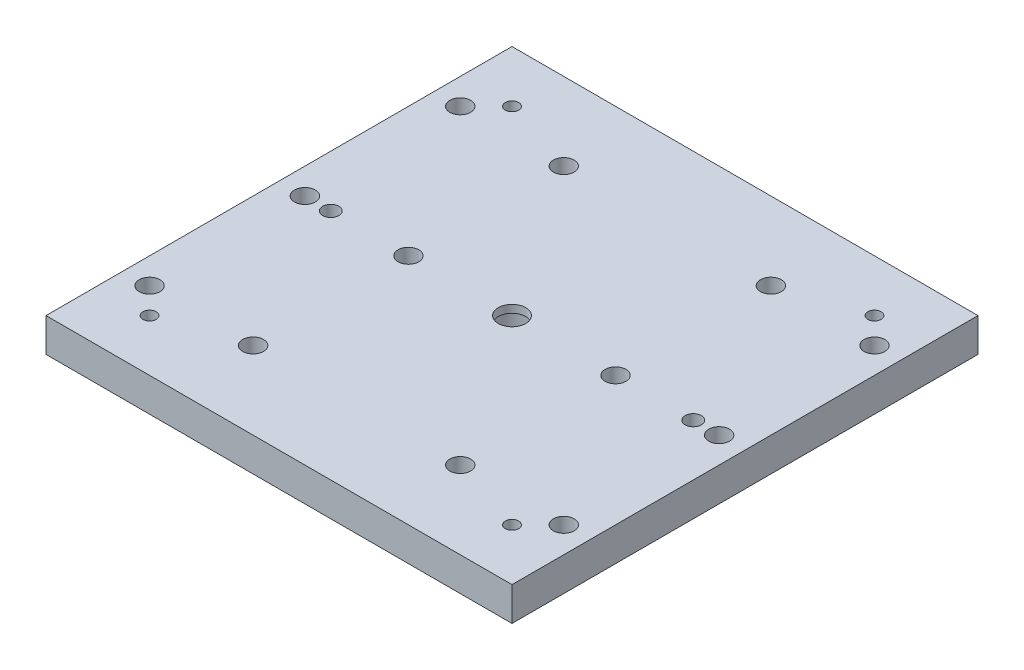
ISO-10303-21;
HEADER;
FILE_DESCRIPTION(('STEP AP214'),'2;1');
FILE_NAME('part.step','',(''),(''),'','','');
FILE_SCHEMA(('AUTOMOTIVE_DESIGN { 1 0 10303 214 1 1 1 1 }'));
ENDSEC;
DATA;
#1=APPLICATION_CONTEXT('core data for automotive mechanical design processes');
#2=APPLICATION_PROTOCOL_DEFINITION('international standard','automotive_design',2000,#1);
#3=PRODUCT_CONTEXT('',#1,'mechanical');
#4=PRODUCT('Part','Part','',(#3));
#5=PRODUCT_RELATED_PRODUCT_CATEGORY('part','',(#4));
#6=PRODUCT_DEFINITION_FORMATION('','',#4);
#7=PRODUCT_DEFINITION_CONTEXT('part definition',#1,'design');
#8=PRODUCT_DEFINITION('design','',#6,#7);
#9=PRODUCT_DEFINITION_SHAPE('','',#8);
#10=(LENGTH_UNIT() NAMED_UNIT(*) SI_UNIT(.MILLI.,.METRE.));
#11=(NAMED_UNIT(*) PLANE_ANGLE_UNIT() SI_UNIT($,.RADIAN.));
#12=(NAMED_UNIT(*) SI_UNIT($,.STERADIAN.) SOLID_ANGLE_UNIT());
#13=UNCERTAINTY_MEASURE_WITH_UNIT(LENGTH_MEASURE(1.E-05),#10,'distance_accuracy_value','');
#14=(GEOMETRIC_REPRESENTATION_CONTEXT(3) GLOBAL_UNCERTAINTY_ASSIGNED_CONTEXT((#13)) GLOBAL_UNIT_ASSIGNED_CONTEXT((#10,
#11,#12)) REPRESENTATION_CONTEXT('',''));
#15=CARTESIAN_POINT('',(0.,0.,0.));
#16=DIRECTION('',(0.,0.,1.));
#17=DIRECTION('',(1.,0.,0.));
#18=AXIS2_PLACEMENT_3D('',#15,#16,#17);
#19=CARTESIAN_POINT('',(0.,0.,0.));
#20=DIRECTION('',(0.,1.,0.));
#21=DIRECTION('',(0.,0.,1.));
#22=AXIS2_PLACEMENT_3D('',#19,#20,#21);
#23=PLANE('',#22);
#24=CARTESIAN_POINT('',(25.4,0.,-38.1));
#25=DIRECTION('',(0.,-1.,0.));
#26=DIRECTION('',(0.,0.,-1.));
#27=AXIS2_PLACEMENT_3D('',#24,#25,#26);
#28=CIRCLE('',#27,2.5527);
#29=CARTESIAN_POINT('',(25.4,0.,-40.6527));
#30=VERTEX_POINT('',#29);
#31=EDGE_CURVE('E220',#30,#30,#28,.T.);
#32=ORIENTED_EDGE('',*,*,#31,.F.);
#33=EDGE_LOOP('',(#32));
#34=FACE_BOUND('',#33,.T.);
#35=CARTESIAN_POINT('',(50.8,0.,-38.1));
#36=DIRECTION('',(0.,-1.,0.));
#37=DIRECTION('',(0.,0.,-1.));
#38=AXIS2_PLACEMENT_3D('',#35,#36,#37);
#39=CIRCLE('',#38,2.5527);
#40=CARTESIAN_POINT('',(50.8,0.,-40.6527));
#41=VERTEX_POINT('',#40);
#42=EDGE_CURVE('E214',#41,#41,#39,.T.);
#43=ORIENTED_EDGE('',*,*,#42,.F.);
#44=EDGE_LOOP('',(#43));
#45=FACE_BOUND('',#44,.T.);
#46=CARTESIAN_POINT('',(50.8,0.,0.));
#47=DIRECTION('',(0.,-1.,0.));
#48=DIRECTION('',(0.,0.,-1.));
#49=AXIS2_PLACEMENT_3D('',#46,#47,#48);
#50=CIRCLE('',#49,2.5527);
#51=CARTESIAN_POINT('',(50.8,0.,-2.55269999999999));
#52=VERTEX_POINT('',#51);
#53=EDGE_CURVE('E208',#52,#52,#50,.T.);
#54=ORIENTED_EDGE('',*,*,#53,.F.);
#55=EDGE_LOOP('',(#54));
#56=FACE_BOUND('',#55,.T.);
#57=CARTESIAN_POINT('',(25.4,0.,0.));
#58=DIRECTION('',(0.,-1.,0.));
#59=DIRECTION('',(0.,0.,-1.));
#60=AXIS2_PLACEMENT_3D('',#57,#58,#59);
#61=CIRCLE('',#60,2.5527);
#62=CARTESIAN_POINT('',(25.4,0.,-2.55269999999999));
#63=VERTEX_POINT('',#62);
#64=EDGE_CURVE('E202',#63,#63,#61,.T.);
#65=ORIENTED_EDGE('',*,*,#64,.F.);
#66=EDGE_LOOP('',(#65));
#67=FACE_BOUND('',#66,.T.);
#68=CARTESIAN_POINT('',(50.8,0.,38.1));
#69=DIRECTION('',(0.,-1.,0.));
#70=DIRECTION('',(0.,0.,-1.));
#71=AXIS2_PLACEMENT_3D('',#68,#69,#70);
#72=CIRCLE('',#71,2.5527);
#73=CARTESIAN_POINT('',(50.8,0.,35.5473));
#74=VERTEX_POINT('',#73);
#75=EDGE_CURVE('E190',#74,#74,#72,.T.);
#76=ORIENTED_EDGE('',*,*,#75,.F.);
#77=EDGE_LOOP('',(#76));
#78=FACE_BOUND('',#77,.T.);
#79=CARTESIAN_POINT('',(-44.45,0.,44.45));
#80=DIRECTION('',(0.,-1.,0.));
#81=DIRECTION('',(0.,0.,-1.));
#82=AXIS2_PLACEMENT_3D('',#79,#80,#81);
#83=CIRCLE('',#82,2.77876);
#84=CARTESIAN_POINT('',(-44.45,0.,41.67124));
#85=VERTEX_POINT('',#84);
#86=EDGE_CURVE('E184',#85,#85,#83,.T.);
#87=ORIENTED_EDGE('',*,*,#86,.F.);
#88=EDGE_LOOP('',(#87));
#89=FACE_BOUND('',#88,.T.);
#90=CARTESIAN_POINT('',(-44.45,0.,-44.45));
#91=DIRECTION('',(0.,-1.,0.));
#92=DIRECTION('',(0.,0.,-1.));
#93=AXIS2_PLACEMENT_3D('',#90,#91,#92);
#94=CIRCLE('',#93,2.77876);
#95=CARTESIAN_POINT('',(-44.45,0.,-47.22876));
#96=VERTEX_POINT('',#95);
#97=EDGE_CURVE('E172',#96,#96,#94,.T.);
#98=ORIENTED_EDGE('',*,*,#97,.F.);
#99=EDGE_LOOP('',(#98));
#100=FACE_BOUND('',#99,.T.);
#101=CARTESIAN_POINT('',(44.45,0.,-44.45));
#102=DIRECTION('',(0.,-1.,0.));
#103=DIRECTION('',(0.,0.,-1.));
#104=AXIS2_PLACEMENT_3D('',#101,#102,#103);
#105=CIRCLE('',#104,2.77876);
#106=CARTESIAN_POINT('',(44.45,0.,-47.22876));
#107=VERTEX_POINT('',#106);
#108=EDGE_CURVE('E160',#107,#107,#105,.T.);
#109=ORIENTED_EDGE('',*,*,#108,.F.);
#110=EDGE_LOOP('',(#109));
#111=FACE_BOUND('',#110,.T.);
#112=CARTESIAN_POINT('',(44.45,0.,0.));
#113=DIRECTION('',(0.,1.,0.));
#114=DIRECTION('',(0.,0.,1.));
#115=AXIS2_PLACEMENT_3D('',#112,#113,#114);
#116=CIRCLE('',#115,1.984375);
#117=CARTESIAN_POINT('',(44.45,0.,1.98437499999998));
#118=VERTEX_POINT('',#117);
#119=EDGE_CURVE('E133',#118,#118,#116,.T.);
#120=ORIENTED_EDGE('',*,*,#119,.T.);
#121=EDGE_LOOP('',(#120));
#122=FACE_BOUND('',#121,.T.);
#123=CARTESIAN_POINT('',(-44.45,0.,0.));
#124=DIRECTION('',(0.,1.,0.));
#125=DIRECTION('',(0.,0.,1.));
#126=AXIS2_PLACEMENT_3D('',#123,#124,#125);
#127=CIRCLE('',#126,1.984375);
#128=CARTESIAN_POINT('',(-44.45,0.,1.98437500000001));
#129=VERTEX_POINT('',#128);
#130=EDGE_CURVE('E127',#129,#129,#127,.T.);
#131=ORIENTED_EDGE('',*,*,#130,.T.);
#132=EDGE_LOOP('',(#131));
#133=FACE_BOUND('',#132,.T.);
#134=CARTESIAN_POINT('',(0.,0.,0.));
#135=DIRECTION('',(0.,-1.,0.));
#136=DIRECTION('',(0.,0.,-1.));
#137=AXIS2_PLACEMENT_3D('',#134,#135,#136);
#138=CIRCLE('',#137,5.55625);
#139=CARTESIAN_POINT('',(0.,0.,-5.55625));
#140=VERTEX_POINT('',#139);
#141=EDGE_CURVE('E124',#140,#140,#138,.T.);
#142=ORIENTED_EDGE('',*,*,#141,.F.);
#143=EDGE_LOOP('',(#142));
#144=FACE_BOUND('',#143,.T.);
#145=DIRECTION('',(0.,0.,-1.));
#146=VECTOR('',#145,1.);
#147=CARTESIAN_POINT('',(57.15,0.,-57.15));
#148=LINE('',#147,#146);
#149=CARTESIAN_POINT('',(57.15,0.,57.15));
#150=VERTEX_POINT('',#149);
#151=CARTESIAN_POINT('',(57.15,0.,-57.15));
#152=VERTEX_POINT('',#151);
#153=EDGE_CURVE('E102',#150,#152,#148,.T.);
#154=ORIENTED_EDGE('',*,*,#153,.F.);
#155=DIRECTION('',(1.,0.,0.));
#156=VECTOR('',#155,1.);
#157=CARTESIAN_POINT('',(-57.15,0.,57.15));
#158=LINE('',#157,#156);
#159=CARTESIAN_POINT('',(-57.15,0.,57.15));
#160=VERTEX_POINT('',#159);
#161=EDGE_CURVE('E78',#160,#150,#158,.T.);
#162=ORIENTED_EDGE('',*,*,#161,.F.);
#163=DIRECTION('',(0.,0.,1.));
#164=VECTOR('',#163,1.);
#165=CARTESIAN_POINT('',(-57.15,0.,-57.15));
#166=LINE('',#165,#164);
#167=CARTESIAN_POINT('',(-57.15,0.,-57.15));
#168=VERTEX_POINT('',#167);
#169=EDGE_CURVE('E72',#168,#160,#166,.T.);
#170=ORIENTED_EDGE('',*,*,#169,.F.);
#171=DIRECTION('',(-1.,0.,0.));
#172=VECTOR('',#171,1.);
#173=CARTESIAN_POINT('',(-57.15,0.,-57.15));
#174=LINE('',#173,#172);
#175=EDGE_CURVE('E94',#152,#168,#174,.T.);
#176=ORIENTED_EDGE('',*,*,#175,.F.);
#177=EDGE_LOOP('',(#154,#162,#170,#176));
#178=FACE_BOUND('',#177,.T.);
#179=CARTESIAN_POINT('',(44.45,0.,44.45));
#180=DIRECTION('',(0.,-1.,0.));
#181=DIRECTION('',(0.,0.,-1.));
#182=AXIS2_PLACEMENT_3D('',#179,#180,#181);
#183=CIRCLE('',#182,2.77876);
#184=CARTESIAN_POINT('',(44.45,0.,41.67124));
#185=VERTEX_POINT('',#184);
#186=EDGE_CURVE('E148',#185,#185,#183,.T.);
#187=ORIENTED_EDGE('',*,*,#186,.F.);
#188=EDGE_LOOP('',(#187));
#189=FACE_BOUND('',#188,.T.);
#190=CARTESIAN_POINT('',(25.4,0.,38.1));
#191=DIRECTION('',(0.,-1.,0.));
#192=DIRECTION('',(0.,0.,-1.));
#193=AXIS2_PLACEMENT_3D('',#190,#191,#192);
#194=CIRCLE('',#193,2.5527);
#195=CARTESIAN_POINT('',(25.4,0.,35.5473));
#196=VERTEX_POINT('',#195);
#197=EDGE_CURVE('E196',#196,#196,#194,.T.);
#198=ORIENTED_EDGE('',*,*,#197,.F.);
#199=EDGE_LOOP('',(#198));
#200=FACE_BOUND('',#199,.T.);
#201=CARTESIAN_POINT('',(-25.4,0.,-38.1));
#202=DIRECTION('',(0.,-1.,0.));
#203=DIRECTION('',(0.,0.,-1.));
#204=AXIS2_PLACEMENT_3D('',#201,#202,#203);
#205=CIRCLE('',#204,2.5527);
#206=CARTESIAN_POINT('',(-25.4,0.,-40.6527));
#207=VERTEX_POINT('',#206);
#208=EDGE_CURVE('E226',#207,#207,#205,.T.);
#209=ORIENTED_EDGE('',*,*,#208,.F.);
#210=EDGE_LOOP('',(#209));
#211=FACE_BOUND('',#210,.T.);
#212=CARTESIAN_POINT('',(-50.8,0.,-38.1));
#213=DIRECTION('',(0.,-1.,0.));
#214=DIRECTION('',(0.,0.,-1.));
#215=AXIS2_PLACEMENT_3D('',#212,#213,#214);
#216=CIRCLE('',#215,2.5527);
#217=CARTESIAN_POINT('',(-50.8,0.,-40.6527));
#218=VERTEX_POINT('',#217);
#219=EDGE_CURVE('E232',#218,#218,#216,.T.);
#220=ORIENTED_EDGE('',*,*,#219,.F.);
#221=EDGE_LOOP('',(#220));
#222=FACE_BOUND('',#221,.T.);
#223=CARTESIAN_POINT('',(-50.8,0.,0.));
#224=DIRECTION('',(0.,-1.,0.));
#225=DIRECTION('',(0.,0.,-1.));
#226=AXIS2_PLACEMENT_3D('',#223,#224,#225);
#227=CIRCLE('',#226,2.5527);
#228=CARTESIAN_POINT('',(-50.8,0.,-2.55269999999999));
#229=VERTEX_POINT('',#228);
#230=EDGE_CURVE('E238',#229,#229,#227,.T.);
#231=ORIENTED_EDGE('',*,*,#230,.F.);
#232=EDGE_LOOP('',(#231));
#233=FACE_BOUND('',#232,.T.);
#234=CARTESIAN_POINT('',(-25.4,0.,0.));
#235=DIRECTION('',(0.,-1.,0.));
#236=DIRECTION('',(0.,0.,-1.));
#237=AXIS2_PLACEMENT_3D('',#234,#235,#236);
#238=CIRCLE('',#237,2.5527);
#239=CARTESIAN_POINT('',(-25.4,0.,-2.55269999999999));
#240=VERTEX_POINT('',#239);
#241=EDGE_CURVE('E244',#240,#240,#238,.T.);
#242=ORIENTED_EDGE('',*,*,#241,.F.);
#243=EDGE_LOOP('',(#242));
#244=FACE_BOUND('',#243,.T.);
#245=CARTESIAN_POINT('',(-25.4,0.,38.1));
#246=DIRECTION('',(0.,-1.,0.));
#247=DIRECTION('',(0.,0.,-1.));
#248=AXIS2_PLACEMENT_3D('',#245,#246,#247);
#249=CIRCLE('',#248,2.5527);
#250=CARTESIAN_POINT('',(-25.4,0.,35.5473));
#251=VERTEX_POINT('',#250);
#252=EDGE_CURVE('E250',#251,#251,#249,.T.);
#253=ORIENTED_EDGE('',*,*,#252,.F.);
#254=EDGE_LOOP('',(#253));
#255=FACE_BOUND('',#254,.T.);
#256=CARTESIAN_POINT('',(-50.8,0.,38.1));
#257=DIRECTION('',(0.,-1.,0.));
#258=DIRECTION('',(0.,0.,-1.));
#259=AXIS2_PLACEMENT_3D('',#256,#257,#258);
#260=CIRCLE('',#259,2.5527);
#261=CARTESIAN_POINT('',(-50.8,0.,35.5473));
#262=VERTEX_POINT('',#261);
#263=EDGE_CURVE('E256',#262,#262,#260,.T.);
#264=ORIENTED_EDGE('',*,*,#263,.F.);
#265=EDGE_LOOP('',(#264));
#266=FACE_BOUND('',#265,.T.);
#267=ADVANCED_FACE('F38',(#34,#45,#56,#67,#78,#89,#100,#111,#122,#133,#144,#178,#189,#200,#211,
#222,#233,#244,#255,#266),#23,.F.);
#268=CARTESIAN_POINT('',(57.15,8.255,-57.15));
#269=DIRECTION('',(-1.,0.,0.));
#270=DIRECTION('',(0.,0.,1.));
#271=AXIS2_PLACEMENT_3D('',#268,#269,#270);
#272=PLANE('',#271);
#273=ORIENTED_EDGE('',*,*,#153,.T.);
#274=DIRECTION('',(0.,-1.,0.));
#275=VECTOR('',#274,1.);
#276=CARTESIAN_POINT('',(57.15,8.255,-57.15));
#277=LINE('',#276,#275);
#278=CARTESIAN_POINT('',(57.15,8.255,-57.15));
#279=VERTEX_POINT('',#278);
#280=EDGE_CURVE('E12',#279,#152,#277,.T.);
#281=ORIENTED_EDGE('',*,*,#280,.F.);
#282=DIRECTION('',(0.,0.,-1.));
#283=VECTOR('',#282,1.);
#284=CARTESIAN_POINT('',(57.15,8.255,-57.15));
#285=LINE('',#284,#283);
#286=CARTESIAN_POINT('',(57.15,8.255,57.15));
#287=VERTEX_POINT('',#286);
#288=EDGE_CURVE('E90',#287,#279,#285,.T.);
#289=ORIENTED_EDGE('',*,*,#288,.F.);
#290=DIRECTION('',(0.,-1.,0.));
#291=VECTOR('',#290,1.);
#292=CARTESIAN_POINT('',(57.15,8.255,57.15));
#293=LINE('',#292,#291);
#294=EDGE_CURVE('E98',#287,#150,#293,.T.);
#295=ORIENTED_EDGE('',*,*,#294,.T.);
#296=EDGE_LOOP('',(#273,#281,#289,#295));
#297=FACE_BOUND('',#296,.T.);
#298=ADVANCED_FACE('F40',(#297),#272,.F.);
#299=CARTESIAN_POINT('',(-57.15,8.255,-57.15));
#300=DIRECTION('',(0.,0.,1.));
#301=DIRECTION('',(1.,0.,0.));
#302=AXIS2_PLACEMENT_3D('',#299,#300,#301);
#303=PLANE('',#302);
#304=ORIENTED_EDGE('',*,*,#175,.T.);
#305=DIRECTION('',(0.,-1.,0.));
#306=VECTOR('',#305,1.);
#307=CARTESIAN_POINT('',(-57.15,8.255,-57.15));
#308=LINE('',#307,#306);
#309=CARTESIAN_POINT('',(-57.15,8.255,-57.15));
#310=VERTEX_POINT('',#309);
#311=EDGE_CURVE('E47',#310,#168,#308,.T.);
#312=ORIENTED_EDGE('',*,*,#311,.F.);
#313=DIRECTION('',(-1.,0.,0.));
#314=VECTOR('',#313,1.);
#315=CARTESIAN_POINT('',(-57.15,8.255,-57.15));
#316=LINE('',#315,#314);
#317=EDGE_CURVE('E85',#279,#310,#316,.T.);
#318=ORIENTED_EDGE('',*,*,#317,.F.);
#319=ORIENTED_EDGE('',*,*,#280,.T.);
#320=EDGE_LOOP('',(#304,#312,#318,#319));
#321=FACE_BOUND('',#320,.T.);
#322=ADVANCED_FACE('F93',(#321),#303,.F.);
#323=CARTESIAN_POINT('',(-57.15,8.255,-57.15));
#324=DIRECTION('',(1.,0.,0.));
#325=DIRECTION('',(0.,0.,-1.));
#326=AXIS2_PLACEMENT_3D('',#323,#324,#325);
#327=PLANE('',#326);
#328=ORIENTED_EDGE('',*,*,#169,.T.);
#329=DIRECTION('',(0.,-1.,0.));
#330=VECTOR('',#329,1.);
#331=CARTESIAN_POINT('',(-57.15,8.255,57.15));
#332=LINE('',#331,#330);
#333=CARTESIAN_POINT('',(-57.15,8.255,57.15));
#334=VERTEX_POINT('',#333);
#335=EDGE_CURVE('E95',#334,#160,#332,.T.);
#336=ORIENTED_EDGE('',*,*,#335,.F.);
#337=DIRECTION('',(0.,0.,1.));
#338=VECTOR('',#337,1.);
#339=CARTESIAN_POINT('',(-57.15,8.255,-57.15));
#340=LINE('',#339,#338);
#341=EDGE_CURVE('E88',#310,#334,#340,.T.);
#342=ORIENTED_EDGE('',*,*,#341,.F.);
#343=ORIENTED_EDGE('',*,*,#311,.T.);
#344=EDGE_LOOP('',(#328,#336,#342,#343));
#345=FACE_BOUND('',#344,.T.);
#346=ADVANCED_FACE('F96',(#345),#327,.F.);
#347=CARTESIAN_POINT('',(-57.15,8.255,57.15));
#348=DIRECTION('',(0.,0.,-1.));
#349=DIRECTION('',(-1.,0.,0.));
#350=AXIS2_PLACEMENT_3D('',#347,#348,#349);
#351=PLANE('',#350);
#352=ORIENTED_EDGE('',*,*,#161,.T.);
#353=ORIENTED_EDGE('',*,*,#294,.F.);
#354=DIRECTION('',(1.,0.,0.));
#355=VECTOR('',#354,1.);
#356=CARTESIAN_POINT('',(-57.15,8.255,57.15));
#357=LINE('',#356,#355);
#358=EDGE_CURVE('E55',#334,#287,#357,.T.);
#359=ORIENTED_EDGE('',*,*,#358,.F.);
#360=ORIENTED_EDGE('',*,*,#335,.T.);
#361=EDGE_LOOP('',(#352,#353,#359,#360));
#362=FACE_BOUND('',#361,.T.);
#363=ADVANCED_FACE('F110',(#362),#351,.F.);
#364=CARTESIAN_POINT('',(0.,8.255,0.));
#365=DIRECTION('',(0.,1.,0.));
#366=DIRECTION('',(0.,0.,1.));
#367=AXIS2_PLACEMENT_3D('',#364,#365,#366);
#368=PLANE('',#367);
#369=CARTESIAN_POINT('',(-50.8,8.255,38.1));
#370=DIRECTION('',(0.,1.,0.));
#371=DIRECTION('',(0.,0.,1.));
#372=AXIS2_PLACEMENT_3D('',#369,#370,#371);
#373=CIRCLE('',#372,2.5527);
#374=CARTESIAN_POINT('',(-50.8,8.255,40.6527));
#375=VERTEX_POINT('',#374);
#376=EDGE_CURVE('E253',#375,#375,#373,.T.);
#377=ORIENTED_EDGE('',*,*,#376,.F.);
#378=EDGE_LOOP('',(#377));
#379=FACE_BOUND('',#378,.T.);
#380=CARTESIAN_POINT('',(-25.4,8.255,38.1));
#381=DIRECTION('',(0.,1.,0.));
#382=DIRECTION('',(0.,0.,1.));
#383=AXIS2_PLACEMENT_3D('',#380,#381,#382);
#384=CIRCLE('',#383,2.5527);
#385=CARTESIAN_POINT('',(-25.4,8.255,40.6527));
#386=VERTEX_POINT('',#385);
#387=EDGE_CURVE('E247',#386,#386,#384,.T.);
#388=ORIENTED_EDGE('',*,*,#387,.F.);
#389=EDGE_LOOP('',(#388));
#390=FACE_BOUND('',#389,.T.);
#391=CARTESIAN_POINT('',(-25.4,8.255,0.));
#392=DIRECTION('',(0.,1.,0.));
#393=DIRECTION('',(0.,0.,1.));
#394=AXIS2_PLACEMENT_3D('',#391,#392,#393);
#395=CIRCLE('',#394,2.5527);
#396=CARTESIAN_POINT('',(-25.4,8.255,2.5527));
#397=VERTEX_POINT('',#396);
#398=EDGE_CURVE('E241',#397,#397,#395,.T.);
#399=ORIENTED_EDGE('',*,*,#398,.F.);
#400=EDGE_LOOP('',(#399));
#401=FACE_BOUND('',#400,.T.);
#402=CARTESIAN_POINT('',(-50.8,8.255,0.));
#403=DIRECTION('',(0.,1.,0.));
#404=DIRECTION('',(0.,0.,1.));
#405=AXIS2_PLACEMENT_3D('',#402,#403,#404);
#406=CIRCLE('',#405,2.5527);
#407=CARTESIAN_POINT('',(-50.8,8.255,2.55270000000001));
#408=VERTEX_POINT('',#407);
#409=EDGE_CURVE('E235',#408,#408,#406,.T.);
#410=ORIENTED_EDGE('',*,*,#409,.F.);
#411=EDGE_LOOP('',(#410));
#412=FACE_BOUND('',#411,.T.);
#413=CARTESIAN_POINT('',(-50.8,8.255,-38.1));
#414=DIRECTION('',(0.,1.,0.));
#415=DIRECTION('',(0.,0.,1.));
#416=AXIS2_PLACEMENT_3D('',#413,#414,#415);
#417=CIRCLE('',#416,2.5527);
#418=CARTESIAN_POINT('',(-50.8,8.255,-35.5473));
#419=VERTEX_POINT('',#418);
#420=EDGE_CURVE('E229',#419,#419,#417,.T.);
#421=ORIENTED_EDGE('',*,*,#420,.F.);
#422=EDGE_LOOP('',(#421));
#423=FACE_BOUND('',#422,.T.);
#424=CARTESIAN_POINT('',(-25.4,8.255,-38.1));
#425=DIRECTION('',(0.,1.,0.));
#426=DIRECTION('',(0.,0.,1.));
#427=AXIS2_PLACEMENT_3D('',#424,#425,#426);
#428=CIRCLE('',#427,2.5527);
#429=CARTESIAN_POINT('',(-25.4,8.255,-35.5473));
#430=VERTEX_POINT('',#429);
#431=EDGE_CURVE('E223',#430,#430,#428,.T.);
#432=ORIENTED_EDGE('',*,*,#431,.F.);
#433=EDGE_LOOP('',(#432));
#434=FACE_BOUND('',#433,.T.);
#435=CARTESIAN_POINT('',(25.4,8.255,-38.1));
#436=DIRECTION('',(0.,1.,0.));
#437=DIRECTION('',(0.,0.,1.));
#438=AXIS2_PLACEMENT_3D('',#435,#436,#437);
#439=CIRCLE('',#438,2.5527);
#440=CARTESIAN_POINT('',(25.4,8.255,-35.5473));
#441=VERTEX_POINT('',#440);
#442=EDGE_CURVE('E217',#441,#441,#439,.T.);
#443=ORIENTED_EDGE('',*,*,#442,.F.);
#444=EDGE_LOOP('',(#443));
#445=FACE_BOUND('',#444,.T.);
#446=CARTESIAN_POINT('',(50.8,8.255,-38.1));
#447=DIRECTION('',(0.,1.,0.));
#448=DIRECTION('',(0.,0.,1.));
#449=AXIS2_PLACEMENT_3D('',#446,#447,#448);
#450=CIRCLE('',#449,2.5527);
#451=CARTESIAN_POINT('',(50.8,8.255,-35.5473));
#452=VERTEX_POINT('',#451);
#453=EDGE_CURVE('E211',#452,#452,#450,.T.);
#454=ORIENTED_EDGE('',*,*,#453,.F.);
#455=EDGE_LOOP('',(#454));
#456=FACE_BOUND('',#455,.T.);
#457=CARTESIAN_POINT('',(50.8,8.255,0.));
#458=DIRECTION('',(0.,1.,0.));
#459=DIRECTION('',(0.,0.,1.));
#460=AXIS2_PLACEMENT_3D('',#457,#458,#459);
#461=CIRCLE('',#460,2.5527);
#462=CARTESIAN_POINT('',(50.8,8.255,2.5527));
#463=VERTEX_POINT('',#462);
#464=EDGE_CURVE('E205',#463,#463,#461,.T.);
#465=ORIENTED_EDGE('',*,*,#464,.F.);
#466=EDGE_LOOP('',(#465));
#467=FACE_BOUND('',#466,.T.);
#468=CARTESIAN_POINT('',(25.4,8.255,0.));
#469=DIRECTION('',(0.,1.,0.));
#470=DIRECTION('',(0.,0.,1.));
#471=AXIS2_PLACEMENT_3D('',#468,#469,#470);
#472=CIRCLE('',#471,2.5527);
#473=CARTESIAN_POINT('',(25.4,8.255,2.5527));
#474=VERTEX_POINT('',#473);
#475=EDGE_CURVE('E199',#474,#474,#472,.T.);
#476=ORIENTED_EDGE('',*,*,#475,.F.);
#477=EDGE_LOOP('',(#476));
#478=FACE_BOUND('',#477,.T.);
#479=CARTESIAN_POINT('',(25.4,8.255,38.1));
#480=DIRECTION('',(0.,1.,0.));
#481=DIRECTION('',(0.,0.,1.));
#482=AXIS2_PLACEMENT_3D('',#479,#480,#481);
#483=CIRCLE('',#482,2.5527);
#484=CARTESIAN_POINT('',(25.4,8.255,40.6527));
#485=VERTEX_POINT('',#484);
#486=EDGE_CURVE('E193',#485,#485,#483,.T.);
#487=ORIENTED_EDGE('',*,*,#486,.F.);
#488=EDGE_LOOP('',(#487));
#489=FACE_BOUND('',#488,.T.);
#490=CARTESIAN_POINT('',(50.8,8.255,38.1));
#491=DIRECTION('',(0.,1.,0.));
#492=DIRECTION('',(0.,0.,1.));
#493=AXIS2_PLACEMENT_3D('',#490,#491,#492);
#494=CIRCLE('',#493,2.5527);
#495=CARTESIAN_POINT('',(50.8,8.255,40.6527));
#496=VERTEX_POINT('',#495);
#497=EDGE_CURVE('E187',#496,#496,#494,.T.);
#498=ORIENTED_EDGE('',*,*,#497,.F.);
#499=EDGE_LOOP('',(#498));
#500=FACE_BOUND('',#499,.T.);
#501=CARTESIAN_POINT('',(-44.45,8.255,44.45));
#502=DIRECTION('',(0.,1.,0.));
#503=DIRECTION('',(0.,0.,1.));
#504=AXIS2_PLACEMENT_3D('',#501,#502,#503);
#505=CIRCLE('',#504,1.63195);
#506=CARTESIAN_POINT('',(-44.45,8.255,46.08195));
#507=VERTEX_POINT('',#506);
#508=EDGE_CURVE('E175',#507,#507,#505,.T.);
#509=ORIENTED_EDGE('',*,*,#508,.F.);
#510=EDGE_LOOP('',(#509));
#511=FACE_BOUND('',#510,.T.);
#512=CARTESIAN_POINT('',(-44.45,8.255,-44.45));
#513=DIRECTION('',(0.,1.,0.));
#514=DIRECTION('',(0.,0.,1.));
#515=AXIS2_PLACEMENT_3D('',#512,#513,#514);
#516=CIRCLE('',#515,1.63195);
#517=CARTESIAN_POINT('',(-44.45,8.255,-42.81805));
#518=VERTEX_POINT('',#517);
#519=EDGE_CURVE('E163',#518,#518,#516,.T.);
#520=ORIENTED_EDGE('',*,*,#519,.F.);
#521=EDGE_LOOP('',(#520));
#522=FACE_BOUND('',#521,.T.);
#523=CARTESIAN_POINT('',(44.45,8.255,-44.45));
#524=DIRECTION('',(0.,1.,0.));
#525=DIRECTION('',(0.,0.,1.));
#526=AXIS2_PLACEMENT_3D('',#523,#524,#525);
#527=CIRCLE('',#526,1.63195);
#528=CARTESIAN_POINT('',(44.45,8.255,-42.81805));
#529=VERTEX_POINT('',#528);
#530=EDGE_CURVE('E151',#529,#529,#527,.T.);
#531=ORIENTED_EDGE('',*,*,#530,.F.);
#532=EDGE_LOOP('',(#531));
#533=FACE_BOUND('',#532,.T.);
#534=CARTESIAN_POINT('',(44.45,8.255,44.45));
#535=DIRECTION('',(0.,1.,0.));
#536=DIRECTION('',(0.,0.,1.));
#537=AXIS2_PLACEMENT_3D('',#534,#535,#536);
#538=CIRCLE('',#537,1.63195);
#539=CARTESIAN_POINT('',(44.45,8.255,46.08195));
#540=VERTEX_POINT('',#539);
#541=EDGE_CURVE('E139',#540,#540,#538,.T.);
#542=ORIENTED_EDGE('',*,*,#541,.F.);
#543=EDGE_LOOP('',(#542));
#544=FACE_BOUND('',#543,.T.);
#545=CARTESIAN_POINT('',(44.45,8.255,0.));
#546=DIRECTION('',(0.,1.,0.));
#547=DIRECTION('',(0.,0.,1.));
#548=AXIS2_PLACEMENT_3D('',#545,#546,#547);
#549=CIRCLE('',#548,1.984375);
#550=CARTESIAN_POINT('',(44.45,8.255,1.98437499999998));
#551=VERTEX_POINT('',#550);
#552=EDGE_CURVE('E136',#551,#551,#549,.T.);
#553=ORIENTED_EDGE('',*,*,#552,.F.);
#554=EDGE_LOOP('',(#553));
#555=FACE_BOUND('',#554,.T.);
#556=CARTESIAN_POINT('',(-44.45,8.255,0.));
#557=DIRECTION('',(0.,1.,0.));
#558=DIRECTION('',(0.,0.,1.));
#559=AXIS2_PLACEMENT_3D('',#556,#557,#558);
#560=CIRCLE('',#559,1.984375);
#561=CARTESIAN_POINT('',(-44.45,8.255,1.98437500000001));
#562=VERTEX_POINT('',#561);
#563=EDGE_CURVE('E130',#562,#562,#560,.T.);
#564=ORIENTED_EDGE('',*,*,#563,.F.);
#565=EDGE_LOOP('',(#564));
#566=FACE_BOUND('',#565,.T.);
#567=CARTESIAN_POINT('',(0.,8.255,0.));
#568=DIRECTION('',(0.,1.,0.));
#569=DIRECTION('',(0.,0.,1.));
#570=AXIS2_PLACEMENT_3D('',#567,#568,#569);
#571=CIRCLE('',#570,3.3782);
#572=CARTESIAN_POINT('',(0.,8.255,3.3782));
#573=VERTEX_POINT('',#572);
#574=EDGE_CURVE('E104',#573,#573,#571,.T.);
#575=ORIENTED_EDGE('',*,*,#574,.F.);
#576=EDGE_LOOP('',(#575));
#577=FACE_BOUND('',#576,.T.);
#578=ORIENTED_EDGE('',*,*,#288,.T.);
#579=ORIENTED_EDGE('',*,*,#317,.T.);
#580=ORIENTED_EDGE('',*,*,#341,.T.);
#581=ORIENTED_EDGE('',*,*,#358,.T.);
#582=EDGE_LOOP('',(#578,#579,#580,#581));
#583=FACE_BOUND('',#582,.T.);
#584=ADVANCED_FACE('F86',(#379,#390,#401,#412,#423,#434,#445,#456,#467,#478,#489,#500,#511,#522,
#533,#544,#555,#566,#577,#583),#368,.T.);
#585=CARTESIAN_POINT('',(0.,0.,0.));
#586=DIRECTION('',(0.,-1.,0.));
#587=DIRECTION('',(0.,0.,-1.));
#588=AXIS2_PLACEMENT_3D('',#585,#586,#587);
#589=CYLINDRICAL_SURFACE('',#588,3.3782);
#590=CARTESIAN_POINT('',(0.,6.35,0.));
#591=DIRECTION('',(0.,-1.,0.));
#592=DIRECTION('',(0.,0.,-1.));
#593=AXIS2_PLACEMENT_3D('',#590,#591,#592);
#594=CIRCLE('',#593,3.3782);
#595=CARTESIAN_POINT('',(0.,6.35,-3.3782));
#596=VERTEX_POINT('',#595);
#597=EDGE_CURVE('E118',#596,#596,#594,.T.);
#598=ORIENTED_EDGE('',*,*,#597,.T.);
#599=EDGE_LOOP('',(#598));
#600=FACE_BOUND('',#599,.T.);
#601=ORIENTED_EDGE('',*,*,#574,.T.);
#602=EDGE_LOOP('',(#601));
#603=FACE_BOUND('',#602,.T.);
#604=ADVANCED_FACE('F297',(#600,#603),#589,.F.);
#605=CARTESIAN_POINT('',(3.3782,6.35,0.));
#606=DIRECTION('',(0.,1.,0.));
#607=DIRECTION('',(0.,0.,1.));
#608=AXIS2_PLACEMENT_3D('',#605,#606,#607);
#609=PLANE('',#608);
#610=ORIENTED_EDGE('',*,*,#597,.F.);
#611=EDGE_LOOP('',(#610));
#612=FACE_BOUND('',#611,.T.);
#613=CARTESIAN_POINT('',(0.,6.35,0.));
#614=DIRECTION('',(0.,-1.,0.));
#615=DIRECTION('',(0.,0.,-1.));
#616=AXIS2_PLACEMENT_3D('',#613,#614,#615);
#617=CIRCLE('',#616,5.55625);
#618=CARTESIAN_POINT('',(0.,6.35,-5.55625));
#619=VERTEX_POINT('',#618);
#620=EDGE_CURVE('E121',#619,#619,#617,.T.);
#621=ORIENTED_EDGE('',*,*,#620,.T.);
#622=EDGE_LOOP('',(#621));
#623=FACE_BOUND('',#622,.T.);
#624=ADVANCED_FACE('F304',(#612,#623),#609,.F.);
#625=CARTESIAN_POINT('',(0.,0.,0.));
#626=DIRECTION('',(0.,-1.,0.));
#627=DIRECTION('',(0.,0.,-1.));
#628=AXIS2_PLACEMENT_3D('',#625,#626,#627);
#629=CYLINDRICAL_SURFACE('',#628,5.55625);
#630=ORIENTED_EDGE('',*,*,#620,.F.);
#631=EDGE_LOOP('',(#630));
#632=FACE_BOUND('',#631,.T.);
#633=ORIENTED_EDGE('',*,*,#141,.T.);
#634=EDGE_LOOP('',(#633));
#635=FACE_BOUND('',#634,.T.);
#636=ADVANCED_FACE('F311',(#632,#635),#629,.F.);
#637=CARTESIAN_POINT('',(-44.45,8.255,0.));
#638=DIRECTION('',(0.,1.,0.));
#639=DIRECTION('',(0.,0.,1.));
#640=AXIS2_PLACEMENT_3D('',#637,#638,#639);
#641=CYLINDRICAL_SURFACE('',#640,1.984375);
#642=ORIENTED_EDGE('',*,*,#130,.F.);
#643=EDGE_LOOP('',(#642));
#644=FACE_BOUND('',#643,.T.);
#645=ORIENTED_EDGE('',*,*,#563,.T.);
#646=EDGE_LOOP('',(#645));
#647=FACE_BOUND('',#646,.T.);
#648=ADVANCED_FACE('F319',(#644,#647),#641,.F.);
#649=CARTESIAN_POINT('',(44.45,8.255,0.));
#650=DIRECTION('',(0.,1.,0.));
#651=DIRECTION('',(0.,0.,1.));
#652=AXIS2_PLACEMENT_3D('',#649,#650,#651);
#653=CYLINDRICAL_SURFACE('',#652,1.984375);
#654=ORIENTED_EDGE('',*,*,#119,.F.);
#655=EDGE_LOOP('',(#654));
#656=FACE_BOUND('',#655,.T.);
#657=ORIENTED_EDGE('',*,*,#552,.T.);
#658=EDGE_LOOP('',(#657));
#659=FACE_BOUND('',#658,.T.);
#660=ADVANCED_FACE('F327',(#656,#659),#653,.F.);
#661=CARTESIAN_POINT('',(44.45,0.,44.45));
#662=DIRECTION('',(0.,-1.,0.));
#663=DIRECTION('',(0.,0.,-1.));
#664=AXIS2_PLACEMENT_3D('',#661,#662,#663);
#665=CYLINDRICAL_SURFACE('',#664,1.63195);
#666=CARTESIAN_POINT('',(44.45,2.8448,44.45));
#667=DIRECTION('',(0.,-1.,0.));
#668=DIRECTION('',(0.,0.,-1.));
#669=AXIS2_PLACEMENT_3D('',#666,#667,#668);
#670=CIRCLE('',#669,1.63195);
#671=CARTESIAN_POINT('',(44.45,2.8448,42.81805));
#672=VERTEX_POINT('',#671);
#673=EDGE_CURVE('E142',#672,#672,#670,.T.);
#674=ORIENTED_EDGE('',*,*,#673,.T.);
#675=EDGE_LOOP('',(#674));
#676=FACE_BOUND('',#675,.T.);
#677=ORIENTED_EDGE('',*,*,#541,.T.);
#678=EDGE_LOOP('',(#677));
#679=FACE_BOUND('',#678,.T.);
#680=ADVANCED_FACE('F335',(#676,#679),#665,.F.);
#681=CARTESIAN_POINT('',(46.08195,2.8448,44.45));
#682=DIRECTION('',(0.,1.,0.));
#683=DIRECTION('',(0.,0.,1.));
#684=AXIS2_PLACEMENT_3D('',#681,#682,#683);
#685=PLANE('',#684);
#686=ORIENTED_EDGE('',*,*,#673,.F.);
#687=EDGE_LOOP('',(#686));
#688=FACE_BOUND('',#687,.T.);
#689=CARTESIAN_POINT('',(44.45,2.8448,44.45));
#690=DIRECTION('',(0.,-1.,0.));
#691=DIRECTION('',(0.,0.,-1.));
#692=AXIS2_PLACEMENT_3D('',#689,#690,#691);
#693=CIRCLE('',#692,2.77876);
#694=CARTESIAN_POINT('',(44.45,2.8448,41.67124));
#695=VERTEX_POINT('',#694);
#696=EDGE_CURVE('E145',#695,#695,#693,.T.);
#697=ORIENTED_EDGE('',*,*,#696,.T.);
#698=EDGE_LOOP('',(#697));
#699=FACE_BOUND('',#698,.T.);
#700=ADVANCED_FACE('F343',(#688,#699),#685,.F.);
#701=CARTESIAN_POINT('',(44.45,0.,44.45));
#702=DIRECTION('',(0.,-1.,0.));
#703=DIRECTION('',(0.,0.,-1.));
#704=AXIS2_PLACEMENT_3D('',#701,#702,#703);
#705=CYLINDRICAL_SURFACE('',#704,2.77876);
#706=ORIENTED_EDGE('',*,*,#696,.F.);
#707=EDGE_LOOP('',(#706));
#708=FACE_BOUND('',#707,.T.);
#709=ORIENTED_EDGE('',*,*,#186,.T.);
#710=EDGE_LOOP('',(#709));
#711=FACE_BOUND('',#710,.T.);
#712=ADVANCED_FACE('F351',(#708,#711),#705,.F.);
#713=CARTESIAN_POINT('',(44.45,0.,-44.45));
#714=DIRECTION('',(0.,-1.,0.));
#715=DIRECTION('',(0.,0.,-1.));
#716=AXIS2_PLACEMENT_3D('',#713,#714,#715);
#717=CYLINDRICAL_SURFACE('',#716,1.63195);
#718=CARTESIAN_POINT('',(44.45,2.8448,-44.45));
#719=DIRECTION('',(0.,-1.,0.));
#720=DIRECTION('',(0.,0.,-1.));
#721=AXIS2_PLACEMENT_3D('',#718,#719,#720);
#722=CIRCLE('',#721,1.63195);
#723=CARTESIAN_POINT('',(44.45,2.8448,-46.08195));
#724=VERTEX_POINT('',#723);
#725=EDGE_CURVE('E154',#724,#724,#722,.T.);
#726=ORIENTED_EDGE('',*,*,#725,.T.);
#727=EDGE_LOOP('',(#726));
#728=FACE_BOUND('',#727,.T.);
#729=ORIENTED_EDGE('',*,*,#530,.T.);
#730=EDGE_LOOP('',(#729));
#731=FACE_BOUND('',#730,.T.);
#732=ADVANCED_FACE('F359',(#728,#731),#717,.F.);
#733=CARTESIAN_POINT('',(46.08195,2.8448,-44.45));
#734=DIRECTION('',(0.,1.,0.));
#735=DIRECTION('',(0.,0.,1.));
#736=AXIS2_PLACEMENT_3D('',#733,#734,#735);
#737=PLANE('',#736);
#738=ORIENTED_EDGE('',*,*,#725,.F.);
#739=EDGE_LOOP('',(#738));
#740=FACE_BOUND('',#739,.T.);
#741=CARTESIAN_POINT('',(44.45,2.8448,-44.45));
#742=DIRECTION('',(0.,-1.,0.));
#743=DIRECTION('',(0.,0.,-1.));
#744=AXIS2_PLACEMENT_3D('',#741,#742,#743);
#745=CIRCLE('',#744,2.77876);
#746=CARTESIAN_POINT('',(44.45,2.8448,-47.22876));
#747=VERTEX_POINT('',#746);
#748=EDGE_CURVE('E157',#747,#747,#745,.T.);
#749=ORIENTED_EDGE('',*,*,#748,.T.);
#750=EDGE_LOOP('',(#749));
#751=FACE_BOUND('',#750,.T.);
#752=ADVANCED_FACE('F367',(#740,#751),#737,.F.);
#753=CARTESIAN_POINT('',(44.45,0.,-44.45));
#754=DIRECTION('',(0.,-1.,0.));
#755=DIRECTION('',(0.,0.,-1.));
#756=AXIS2_PLACEMENT_3D('',#753,#754,#755);
#757=CYLINDRICAL_SURFACE('',#756,2.77876);
#758=ORIENTED_EDGE('',*,*,#748,.F.);
#759=EDGE_LOOP('',(#758));
#760=FACE_BOUND('',#759,.T.);
#761=ORIENTED_EDGE('',*,*,#108,.T.);
#762=EDGE_LOOP('',(#761));
#763=FACE_BOUND('',#762,.T.);
#764=ADVANCED_FACE('F375',(#760,#763),#757,.F.);
#765=CARTESIAN_POINT('',(-44.45,0.,-44.45));
#766=DIRECTION('',(0.,-1.,0.));
#767=DIRECTION('',(0.,0.,-1.));
#768=AXIS2_PLACEMENT_3D('',#765,#766,#767);
#769=CYLINDRICAL_SURFACE('',#768,1.63195);
#770=CARTESIAN_POINT('',(-44.45,2.8448,-44.45));
#771=DIRECTION('',(0.,-1.,0.));
#772=DIRECTION('',(0.,0.,-1.));
#773=AXIS2_PLACEMENT_3D('',#770,#771,#772);
#774=CIRCLE('',#773,1.63195);
#775=CARTESIAN_POINT('',(-44.45,2.8448,-46.08195));
#776=VERTEX_POINT('',#775);
#777=EDGE_CURVE('E166',#776,#776,#774,.T.);
#778=ORIENTED_EDGE('',*,*,#777,.T.);
#779=EDGE_LOOP('',(#778));
#780=FACE_BOUND('',#779,.T.);
#781=ORIENTED_EDGE('',*,*,#519,.T.);
#782=EDGE_LOOP('',(#781));
#783=FACE_BOUND('',#782,.T.);
#784=ADVANCED_FACE('F383',(#780,#783),#769,.F.);
#785=CARTESIAN_POINT('',(-42.81805,2.8448,-44.45));
#786=DIRECTION('',(0.,1.,0.));
#787=DIRECTION('',(0.,0.,1.));
#788=AXIS2_PLACEMENT_3D('',#785,#786,#787);
#789=PLANE('',#788);
#790=ORIENTED_EDGE('',*,*,#777,.F.);
#791=EDGE_LOOP('',(#790));
#792=FACE_BOUND('',#791,.T.);
#793=CARTESIAN_POINT('',(-44.45,2.8448,-44.45));
#794=DIRECTION('',(0.,-1.,0.));
#795=DIRECTION('',(0.,0.,-1.));
#796=AXIS2_PLACEMENT_3D('',#793,#794,#795);
#797=CIRCLE('',#796,2.77876);
#798=CARTESIAN_POINT('',(-44.45,2.8448,-47.22876));
#799=VERTEX_POINT('',#798);
#800=EDGE_CURVE('E169',#799,#799,#797,.T.);
#801=ORIENTED_EDGE('',*,*,#800,.T.);
#802=EDGE_LOOP('',(#801));
#803=FACE_BOUND('',#802,.T.);
#804=ADVANCED_FACE('F391',(#792,#803),#789,.F.);
#805=CARTESIAN_POINT('',(-44.45,0.,-44.45));
#806=DIRECTION('',(0.,-1.,0.));
#807=DIRECTION('',(0.,0.,-1.));
#808=AXIS2_PLACEMENT_3D('',#805,#806,#807);
#809=CYLINDRICAL_SURFACE('',#808,2.77876);
#810=ORIENTED_EDGE('',*,*,#800,.F.);
#811=EDGE_LOOP('',(#810));
#812=FACE_BOUND('',#811,.T.);
#813=ORIENTED_EDGE('',*,*,#97,.T.);
#814=EDGE_LOOP('',(#813));
#815=FACE_BOUND('',#814,.T.);
#816=ADVANCED_FACE('F399',(#812,#815),#809,.F.);
#817=CARTESIAN_POINT('',(-44.45,0.,44.45));
#818=DIRECTION('',(0.,-1.,0.));
#819=DIRECTION('',(0.,0.,-1.));
#820=AXIS2_PLACEMENT_3D('',#817,#818,#819);
#821=CYLINDRICAL_SURFACE('',#820,1.63195);
#822=CARTESIAN_POINT('',(-44.45,2.8448,44.45));
#823=DIRECTION('',(0.,-1.,0.));
#824=DIRECTION('',(0.,0.,-1.));
#825=AXIS2_PLACEMENT_3D('',#822,#823,#824);
#826=CIRCLE('',#825,1.63195);
#827=CARTESIAN_POINT('',(-44.45,2.8448,42.81805));
#828=VERTEX_POINT('',#827);
#829=EDGE_CURVE('E178',#828,#828,#826,.T.);
#830=ORIENTED_EDGE('',*,*,#829,.T.);
#831=EDGE_LOOP('',(#830));
#832=FACE_BOUND('',#831,.T.);
#833=ORIENTED_EDGE('',*,*,#508,.T.);
#834=EDGE_LOOP('',(#833));
#835=FACE_BOUND('',#834,.T.);
#836=ADVANCED_FACE('F407',(#832,#835),#821,.F.);
#837=CARTESIAN_POINT('',(-42.81805,2.8448,44.45));
#838=DIRECTION('',(0.,1.,0.));
#839=DIRECTION('',(0.,0.,1.));
#840=AXIS2_PLACEMENT_3D('',#837,#838,#839);
#841=PLANE('',#840);
#842=ORIENTED_EDGE('',*,*,#829,.F.);
#843=EDGE_LOOP('',(#842));
#844=FACE_BOUND('',#843,.T.);
#845=CARTESIAN_POINT('',(-44.45,2.8448,44.45));
#846=DIRECTION('',(0.,-1.,0.));
#847=DIRECTION('',(0.,0.,-1.));
#848=AXIS2_PLACEMENT_3D('',#845,#846,#847);
#849=CIRCLE('',#848,2.77876);
#850=CARTESIAN_POINT('',(-44.45,2.8448,41.67124));
#851=VERTEX_POINT('',#850);
#852=EDGE_CURVE('E181',#851,#851,#849,.T.);
#853=ORIENTED_EDGE('',*,*,#852,.T.);
#854=EDGE_LOOP('',(#853));
#855=FACE_BOUND('',#854,.T.);
#856=ADVANCED_FACE('F415',(#844,#855),#841,.F.);
#857=CARTESIAN_POINT('',(-44.45,0.,44.45));
#858=DIRECTION('',(0.,-1.,0.));
#859=DIRECTION('',(0.,0.,-1.));
#860=AXIS2_PLACEMENT_3D('',#857,#858,#859);
#861=CYLINDRICAL_SURFACE('',#860,2.77876);
#862=ORIENTED_EDGE('',*,*,#852,.F.);
#863=EDGE_LOOP('',(#862));
#864=FACE_BOUND('',#863,.T.);
#865=ORIENTED_EDGE('',*,*,#86,.T.);
#866=EDGE_LOOP('',(#865));
#867=FACE_BOUND('',#866,.T.);
#868=ADVANCED_FACE('F423',(#864,#867),#861,.F.);
#869=CARTESIAN_POINT('',(50.8,0.,38.1));
#870=DIRECTION('',(0.,-1.,0.));
#871=DIRECTION('',(0.,0.,-1.));
#872=AXIS2_PLACEMENT_3D('',#869,#870,#871);
#873=CYLINDRICAL_SURFACE('',#872,2.5527);
#874=ORIENTED_EDGE('',*,*,#75,.T.);
#875=EDGE_LOOP('',(#874));
#876=FACE_BOUND('',#875,.T.);
#877=ORIENTED_EDGE('',*,*,#497,.T.);
#878=EDGE_LOOP('',(#877));
#879=FACE_BOUND('',#878,.T.);
#880=ADVANCED_FACE('F431',(#876,#879),#873,.F.);
#881=CARTESIAN_POINT('',(25.4,0.,38.1));
#882=DIRECTION('',(0.,-1.,0.));
#883=DIRECTION('',(0.,0.,-1.));
#884=AXIS2_PLACEMENT_3D('',#881,#882,#883);
#885=CYLINDRICAL_SURFACE('',#884,2.5527);
#886=ORIENTED_EDGE('',*,*,#197,.T.);
#887=EDGE_LOOP('',(#886));
#888=FACE_BOUND('',#887,.T.);
#889=ORIENTED_EDGE('',*,*,#486,.T.);
#890=EDGE_LOOP('',(#889));
#891=FACE_BOUND('',#890,.T.);
#892=ADVANCED_FACE('F439',(#888,#891),#885,.F.);
#893=CARTESIAN_POINT('',(25.4,0.,0.));
#894=DIRECTION('',(0.,-1.,0.));
#895=DIRECTION('',(0.,0.,-1.));
#896=AXIS2_PLACEMENT_3D('',#893,#894,#895);
#897=CYLINDRICAL_SURFACE('',#896,2.5527);
#898=ORIENTED_EDGE('',*,*,#64,.T.);
#899=EDGE_LOOP('',(#898));
#900=FACE_BOUND('',#899,.T.);
#901=ORIENTED_EDGE('',*,*,#475,.T.);
#902=EDGE_LOOP('',(#901));
#903=FACE_BOUND('',#902,.T.);
#904=ADVANCED_FACE('F446',(#900,#903),#897,.F.);
#905=CARTESIAN_POINT('',(50.8,0.,0.));
#906=DIRECTION('',(0.,-1.,0.));
#907=DIRECTION('',(0.,0.,-1.));
#908=AXIS2_PLACEMENT_3D('',#905,#906,#907);
#909=CYLINDRICAL_SURFACE('',#908,2.5527);
#910=ORIENTED_EDGE('',*,*,#53,.T.);
#911=EDGE_LOOP('',(#910));
#912=FACE_BOUND('',#911,.T.);
#913=ORIENTED_EDGE('',*,*,#464,.T.);
#914=EDGE_LOOP('',(#913));
#915=FACE_BOUND('',#914,.T.);
#916=ADVANCED_FACE('F454',(#912,#915),#909,.F.);
#917=CARTESIAN_POINT('',(50.8,0.,-38.1));
#918=DIRECTION('',(0.,-1.,0.));
#919=DIRECTION('',(0.,0.,-1.));
#920=AXIS2_PLACEMENT_3D('',#917,#918,#919);
#921=CYLINDRICAL_SURFACE('',#920,2.5527);
#922=ORIENTED_EDGE('',*,*,#42,.T.);
#923=EDGE_LOOP('',(#922));
#924=FACE_BOUND('',#923,.T.);
#925=ORIENTED_EDGE('',*,*,#453,.T.);
#926=EDGE_LOOP('',(#925));
#927=FACE_BOUND('',#926,.T.);
#928=ADVANCED_FACE('F462',(#924,#927),#921,.F.);
#929=CARTESIAN_POINT('',(25.4,0.,-38.1));
#930=DIRECTION('',(0.,-1.,0.));
#931=DIRECTION('',(0.,0.,-1.));
#932=AXIS2_PLACEMENT_3D('',#929,#930,#931);
#933=CYLINDRICAL_SURFACE('',#932,2.5527);
#934=ORIENTED_EDGE('',*,*,#31,.T.);
#935=EDGE_LOOP('',(#934));
#936=FACE_BOUND('',#935,.T.);
#937=ORIENTED_EDGE('',*,*,#442,.T.);
#938=EDGE_LOOP('',(#937));
#939=FACE_BOUND('',#938,.T.);
#940=ADVANCED_FACE('F470',(#936,#939),#933,.F.);
#941=CARTESIAN_POINT('',(-25.4,0.,-38.1));
#942=DIRECTION('',(0.,-1.,0.));
#943=DIRECTION('',(0.,0.,-1.));
#944=AXIS2_PLACEMENT_3D('',#941,#942,#943);
#945=CYLINDRICAL_SURFACE('',#944,2.5527);
#946=ORIENTED_EDGE('',*,*,#208,.T.);
#947=EDGE_LOOP('',(#946));
#948=FACE_BOUND('',#947,.T.);
#949=ORIENTED_EDGE('',*,*,#431,.T.);
#950=EDGE_LOOP('',(#949));
#951=FACE_BOUND('',#950,.T.);
#952=ADVANCED_FACE('F478',(#948,#951),#945,.F.);
#953=CARTESIAN_POINT('',(-50.8,0.,-38.1));
#954=DIRECTION('',(0.,-1.,0.));
#955=DIRECTION('',(0.,0.,-1.));
#956=AXIS2_PLACEMENT_3D('',#953,#954,#955);
#957=CYLINDRICAL_SURFACE('',#956,2.5527);
#958=ORIENTED_EDGE('',*,*,#219,.T.);
#959=EDGE_LOOP('',(#958));
#960=FACE_BOUND('',#959,.T.);
#961=ORIENTED_EDGE('',*,*,#420,.T.);
#962=EDGE_LOOP('',(#961));
#963=FACE_BOUND('',#962,.T.);
#964=ADVANCED_FACE('F486',(#960,#963),#957,.F.);
#965=CARTESIAN_POINT('',(-50.8,0.,0.));
#966=DIRECTION('',(0.,-1.,0.));
#967=DIRECTION('',(0.,0.,-1.));
#968=AXIS2_PLACEMENT_3D('',#965,#966,#967);
#969=CYLINDRICAL_SURFACE('',#968,2.5527);
#970=ORIENTED_EDGE('',*,*,#230,.T.);
#971=EDGE_LOOP('',(#970));
#972=FACE_BOUND('',#971,.T.);
#973=ORIENTED_EDGE('',*,*,#409,.T.);
#974=EDGE_LOOP('',(#973));
#975=FACE_BOUND('',#974,.T.);
#976=ADVANCED_FACE('F494',(#972,#975),#969,.F.);
#977=CARTESIAN_POINT('',(-25.4,0.,0.));
#978=DIRECTION('',(0.,-1.,0.));
#979=DIRECTION('',(0.,0.,-1.));
#980=AXIS2_PLACEMENT_3D('',#977,#978,#979);
#981=CYLINDRICAL_SURFACE('',#980,2.5527);
#982=ORIENTED_EDGE('',*,*,#241,.T.);
#983=EDGE_LOOP('',(#982));
#984=FACE_BOUND('',#983,.T.);
#985=ORIENTED_EDGE('',*,*,#398,.T.);
#986=EDGE_LOOP('',(#985));
#987=FACE_BOUND('',#986,.T.);
#988=ADVANCED_FACE('F502',(#984,#987),#981,.F.);
#989=CARTESIAN_POINT('',(-25.4,0.,38.1));
#990=DIRECTION('',(0.,-1.,0.));
#991=DIRECTION('',(0.,0.,-1.));
#992=AXIS2_PLACEMENT_3D('',#989,#990,#991);
#993=CYLINDRICAL_SURFACE('',#992,2.5527);
#994=ORIENTED_EDGE('',*,*,#252,.T.);
#995=EDGE_LOOP('',(#994));
#996=FACE_BOUND('',#995,.T.);
#997=ORIENTED_EDGE('',*,*,#387,.T.);
#998=EDGE_LOOP('',(#997));
#999=FACE_BOUND('',#998,.T.);
#1000=ADVANCED_FACE('F510',(#996,#999),#993,.F.);
#1001=CARTESIAN_POINT('',(-50.8,0.,38.1));
#1002=DIRECTION('',(0.,-1.,0.));
#1003=DIRECTION('',(0.,0.,-1.));
#1004=AXIS2_PLACEMENT_3D('',#1001,#1002,#1003);
#1005=CYLINDRICAL_SURFACE('',#1004,2.5527);
#1006=ORIENTED_EDGE('',*,*,#263,.T.);
#1007=EDGE_LOOP('',(#1006));
#1008=FACE_BOUND('',#1007,.T.);
#1009=ORIENTED_EDGE('',*,*,#376,.T.);
#1010=EDGE_LOOP('',(#1009));
#1011=FACE_BOUND('',#1010,.T.);
#1012=ADVANCED_FACE('F260',(#1008,#1011),#1005,.F.);
#1013=CLOSED_SHELL('',(#267,#298,#322,#346,#363,#584,#604,#624,#636,#648,#660,#680,#700,#712,
#732,#752,#764,#784,#804,#816,#836,#856,#868,#880,#892,#904,#916,#928,#940,#952,#964,#976,#988,
#1000,#1012));
#1014=MANIFOLD_SOLID_BREP('B2',#1013);
#1015=ADVANCED_BREP_SHAPE_REPRESENTATION('',(#18,#1014),#14);
#1016=SHAPE_DEFINITION_REPRESENTATION(#9,#1015);
ENDSEC;
END-ISO-10303-21;
